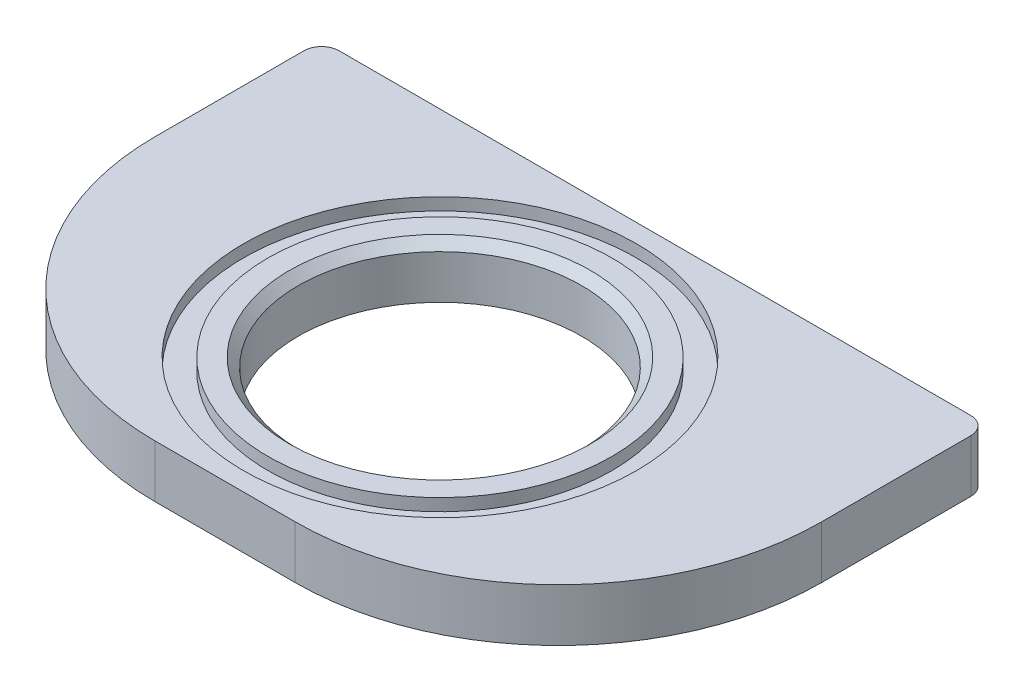
ISO-10303-21;
HEADER;
FILE_DESCRIPTION(('STEP AP214'),'2;1');
FILE_NAME('part.step','',(''),(''),'','','');
FILE_SCHEMA(('AUTOMOTIVE_DESIGN { 1 0 10303 214 1 1 1 1 }'));
ENDSEC;
DATA;
#1=APPLICATION_CONTEXT('core data for automotive mechanical design processes');
#2=APPLICATION_PROTOCOL_DEFINITION('international standard','automotive_design',2000,#1);
#3=PRODUCT_CONTEXT('',#1,'mechanical');
#4=PRODUCT('Part','Part','',(#3));
#5=PRODUCT_RELATED_PRODUCT_CATEGORY('part','',(#4));
#6=PRODUCT_DEFINITION_FORMATION('','',#4);
#7=PRODUCT_DEFINITION_CONTEXT('part definition',#1,'design');
#8=PRODUCT_DEFINITION('design','',#6,#7);
#9=PRODUCT_DEFINITION_SHAPE('','',#8);
#10=(LENGTH_UNIT() NAMED_UNIT(*) SI_UNIT(.MILLI.,.METRE.));
#11=(NAMED_UNIT(*) PLANE_ANGLE_UNIT() SI_UNIT($,.RADIAN.));
#12=(NAMED_UNIT(*) SI_UNIT($,.STERADIAN.) SOLID_ANGLE_UNIT());
#13=UNCERTAINTY_MEASURE_WITH_UNIT(LENGTH_MEASURE(1.E-05),#10,'distance_accuracy_value','');
#14=(GEOMETRIC_REPRESENTATION_CONTEXT(3) GLOBAL_UNCERTAINTY_ASSIGNED_CONTEXT((#13)) GLOBAL_UNIT_ASSIGNED_CONTEXT((#10,
#11,#12)) REPRESENTATION_CONTEXT('',''));
#15=CARTESIAN_POINT('',(0.,0.,0.));
#16=DIRECTION('',(0.,0.,1.));
#17=DIRECTION('',(1.,0.,0.));
#18=AXIS2_PLACEMENT_3D('',#15,#16,#17);
#19=CARTESIAN_POINT('',(0.,3.,0.));
#20=DIRECTION('',(0.,1.,0.));
#21=DIRECTION('',(0.,0.,1.));
#22=AXIS2_PLACEMENT_3D('',#19,#20,#21);
#23=PLANE('',#22);
#24=CARTESIAN_POINT('',(0.,3.,0.));
#25=DIRECTION('',(0.,1.,0.));
#26=DIRECTION('',(0.,0.,1.));
#27=AXIS2_PLACEMENT_3D('',#24,#25,#26);
#28=CIRCLE('',#27,8.57500000000001);
#29=CARTESIAN_POINT('',(0.,3.,8.57500000000001));
#30=VERTEX_POINT('',#29);
#31=EDGE_CURVE('E11',#30,#30,#28,.F.);
#32=ORIENTED_EDGE('',*,*,#31,.T.);
#33=EDGE_LOOP('',(#32));
#34=FACE_BOUND('',#33,.T.);
#35=CARTESIAN_POINT('',(0.,3.,0.));
#36=DIRECTION('',(0.,1.,0.));
#37=DIRECTION('',(0.,0.,1.));
#38=AXIS2_PLACEMENT_3D('',#35,#36,#37);
#39=CIRCLE('',#38,9.8);
#40=CARTESIAN_POINT('',(9.8,3.,0.));
#41=VERTEX_POINT('',#40);
#42=EDGE_CURVE('E126',#41,#41,#39,.T.);
#43=ORIENTED_EDGE('',*,*,#42,.T.);
#44=EDGE_LOOP('',(#43));
#45=FACE_BOUND('',#44,.T.);
#46=ADVANCED_FACE('F39',(#34,#45),#23,.T.);
#47=CARTESIAN_POINT('',(0.,3.,0.));
#48=DIRECTION('',(0.,1.,0.));
#49=DIRECTION('',(0.,0.,1.));
#50=AXIS2_PLACEMENT_3D('',#47,#48,#49);
#51=CIRCLE('',#50,11.2);
#52=CARTESIAN_POINT('',(11.2,3.,0.));
#53=VERTEX_POINT('',#52);
#54=EDGE_CURVE('E178',#53,#53,#51,.F.);
#55=ORIENTED_EDGE('',*,*,#54,.T.);
#56=EDGE_LOOP('',(#55));
#57=FACE_BOUND('',#56,.T.);
#58=DIRECTION('',(-1.,0.,0.));
#59=VECTOR('',#58,1.);
#60=CARTESIAN_POINT('',(-19.,3.,-12.25));
#61=LINE('',#60,#59);
#62=CARTESIAN_POINT('',(18.,3.,-12.25));
#63=VERTEX_POINT('',#62);
#64=CARTESIAN_POINT('',(-18.,3.,-12.25));
#65=VERTEX_POINT('',#64);
#66=EDGE_CURVE('E149',#63,#65,#61,.T.);
#67=ORIENTED_EDGE('',*,*,#66,.T.);
#68=CARTESIAN_POINT('',(-18.,3.,-11.25));
#69=DIRECTION('',(0.,1.,0.));
#70=DIRECTION('',(0.,0.,1.));
#71=AXIS2_PLACEMENT_3D('',#68,#69,#70);
#72=CIRCLE('',#71,1.);
#73=CARTESIAN_POINT('',(-19.,3.,-11.25));
#74=VERTEX_POINT('',#73);
#75=EDGE_CURVE('E195',#65,#74,#72,.T.);
#76=ORIENTED_EDGE('',*,*,#75,.T.);
#77=DIRECTION('',(0.,0.,1.));
#78=VECTOR('',#77,1.);
#79=CARTESIAN_POINT('',(-19.,3.,-12.25));
#80=LINE('',#79,#78);
#81=CARTESIAN_POINT('',(-19.,3.,-2.75));
#82=VERTEX_POINT('',#81);
#83=EDGE_CURVE('E141',#74,#82,#80,.T.);
#84=ORIENTED_EDGE('',*,*,#83,.T.);
#85=CARTESIAN_POINT('',(-4.,3.,-2.75));
#86=DIRECTION('',(0.,1.,0.));
#87=DIRECTION('',(0.,0.,1.));
#88=AXIS2_PLACEMENT_3D('',#85,#86,#87);
#89=CIRCLE('',#88,15.);
#90=CARTESIAN_POINT('',(-4.,3.,12.25));
#91=VERTEX_POINT('',#90);
#92=EDGE_CURVE('E171',#82,#91,#89,.T.);
#93=ORIENTED_EDGE('',*,*,#92,.T.);
#94=DIRECTION('',(1.,0.,0.));
#95=VECTOR('',#94,1.);
#96=CARTESIAN_POINT('',(-19.,3.,12.25));
#97=LINE('',#96,#95);
#98=CARTESIAN_POINT('',(4.,3.,12.25));
#99=VERTEX_POINT('',#98);
#100=EDGE_CURVE('E143',#91,#99,#97,.T.);
#101=ORIENTED_EDGE('',*,*,#100,.T.);
#102=CARTESIAN_POINT('',(4.,3.,-2.75));
#103=DIRECTION('',(0.,1.,0.));
#104=DIRECTION('',(0.,0.,1.));
#105=AXIS2_PLACEMENT_3D('',#102,#103,#104);
#106=CIRCLE('',#105,15.);
#107=CARTESIAN_POINT('',(19.,3.,-2.75));
#108=VERTEX_POINT('',#107);
#109=EDGE_CURVE('E173',#99,#108,#106,.T.);
#110=ORIENTED_EDGE('',*,*,#109,.T.);
#111=DIRECTION('',(0.,0.,-1.));
#112=VECTOR('',#111,1.);
#113=CARTESIAN_POINT('',(19.,3.,-12.25));
#114=LINE('',#113,#112);
#115=CARTESIAN_POINT('',(19.,3.,-11.25));
#116=VERTEX_POINT('',#115);
#117=EDGE_CURVE('E147',#108,#116,#114,.T.);
#118=ORIENTED_EDGE('',*,*,#117,.T.);
#119=CARTESIAN_POINT('',(18.,3.,-11.25));
#120=DIRECTION('',(0.,1.,0.));
#121=DIRECTION('',(0.,0.,1.));
#122=AXIS2_PLACEMENT_3D('',#119,#120,#121);
#123=CIRCLE('',#122,1.);
#124=EDGE_CURVE('E193',#116,#63,#123,.T.);
#125=ORIENTED_EDGE('',*,*,#124,.T.);
#126=EDGE_LOOP('',(#67,#76,#84,#93,#101,#110,#118,#125));
#127=FACE_BOUND('',#126,.T.);
#128=ADVANCED_FACE('F213',(#57,#127),#23,.T.);
#129=CARTESIAN_POINT('',(0.,0.,0.));
#130=DIRECTION('',(0.,1.,0.));
#131=DIRECTION('',(0.,0.,1.));
#132=AXIS2_PLACEMENT_3D('',#129,#130,#131);
#133=PLANE('',#132);
#134=DIRECTION('',(0.,0.,1.));
#135=VECTOR('',#134,1.);
#136=CARTESIAN_POINT('',(-19.,0.,-12.25));
#137=LINE('',#136,#135);
#138=CARTESIAN_POINT('',(-19.,0.,-11.25));
#139=VERTEX_POINT('',#138);
#140=CARTESIAN_POINT('',(-19.,0.,-2.75));
#141=VERTEX_POINT('',#140);
#142=EDGE_CURVE('E140',#139,#141,#137,.T.);
#143=ORIENTED_EDGE('',*,*,#142,.F.);
#144=CARTESIAN_POINT('',(-18.,0.,-11.25));
#145=DIRECTION('',(0.,1.,0.));
#146=DIRECTION('',(0.,0.,1.));
#147=AXIS2_PLACEMENT_3D('',#144,#145,#146);
#148=CIRCLE('',#147,1.);
#149=CARTESIAN_POINT('',(-18.,0.,-12.25));
#150=VERTEX_POINT('',#149);
#151=EDGE_CURVE('E187',#139,#150,#148,.F.);
#152=ORIENTED_EDGE('',*,*,#151,.T.);
#153=DIRECTION('',(-1.,0.,0.));
#154=VECTOR('',#153,1.);
#155=CARTESIAN_POINT('',(-19.,0.,-12.25));
#156=LINE('',#155,#154);
#157=CARTESIAN_POINT('',(18.,0.,-12.25));
#158=VERTEX_POINT('',#157);
#159=EDGE_CURVE('E144',#158,#150,#156,.T.);
#160=ORIENTED_EDGE('',*,*,#159,.F.);
#161=CARTESIAN_POINT('',(18.,0.,-11.25));
#162=DIRECTION('',(0.,1.,0.));
#163=DIRECTION('',(0.,0.,1.));
#164=AXIS2_PLACEMENT_3D('',#161,#162,#163);
#165=CIRCLE('',#164,1.);
#166=CARTESIAN_POINT('',(19.,0.,-11.25));
#167=VERTEX_POINT('',#166);
#168=EDGE_CURVE('E185',#158,#167,#165,.F.);
#169=ORIENTED_EDGE('',*,*,#168,.T.);
#170=DIRECTION('',(0.,0.,-1.));
#171=VECTOR('',#170,1.);
#172=CARTESIAN_POINT('',(19.,0.,-12.25));
#173=LINE('',#172,#171);
#174=CARTESIAN_POINT('',(19.,0.,-2.75));
#175=VERTEX_POINT('',#174);
#176=EDGE_CURVE('E156',#175,#167,#173,.T.);
#177=ORIENTED_EDGE('',*,*,#176,.F.);
#178=CARTESIAN_POINT('',(4.,0.,-2.75));
#179=DIRECTION('',(0.,1.,0.));
#180=DIRECTION('',(0.,0.,1.));
#181=AXIS2_PLACEMENT_3D('',#178,#179,#180);
#182=CIRCLE('',#181,15.);
#183=CARTESIAN_POINT('',(4.,0.,12.25));
#184=VERTEX_POINT('',#183);
#185=EDGE_CURVE('E164',#175,#184,#182,.F.);
#186=ORIENTED_EDGE('',*,*,#185,.T.);
#187=DIRECTION('',(1.,0.,0.));
#188=VECTOR('',#187,1.);
#189=CARTESIAN_POINT('',(-19.,0.,12.25));
#190=LINE('',#189,#188);
#191=CARTESIAN_POINT('',(-4.,0.,12.25));
#192=VERTEX_POINT('',#191);
#193=EDGE_CURVE('E153',#192,#184,#190,.T.);
#194=ORIENTED_EDGE('',*,*,#193,.F.);
#195=CARTESIAN_POINT('',(-4.,0.,-2.75));
#196=DIRECTION('',(0.,1.,0.));
#197=DIRECTION('',(0.,0.,1.));
#198=AXIS2_PLACEMENT_3D('',#195,#196,#197);
#199=CIRCLE('',#198,15.);
#200=EDGE_CURVE('E161',#192,#141,#199,.F.);
#201=ORIENTED_EDGE('',*,*,#200,.T.);
#202=EDGE_LOOP('',(#143,#152,#160,#169,#177,#186,#194,#201));
#203=FACE_BOUND('',#202,.T.);
#204=CARTESIAN_POINT('',(0.,0.,0.));
#205=DIRECTION('',(0.,1.,0.));
#206=DIRECTION('',(0.,0.,1.));
#207=AXIS2_PLACEMENT_3D('',#204,#205,#206);
#208=CIRCLE('',#207,8.075);
#209=CARTESIAN_POINT('',(0.,0.,8.075));
#210=VERTEX_POINT('',#209);
#211=EDGE_CURVE('E136',#210,#210,#208,.T.);
#212=ORIENTED_EDGE('',*,*,#211,.T.);
#213=EDGE_LOOP('',(#212));
#214=FACE_BOUND('',#213,.T.);
#215=ADVANCED_FACE('F221',(#203,#214),#133,.F.);
#216=CARTESIAN_POINT('',(-19.,3.,-12.25));
#217=DIRECTION('',(1.,0.,0.));
#218=DIRECTION('',(0.,0.,-1.));
#219=AXIS2_PLACEMENT_3D('',#216,#217,#218);
#220=PLANE('',#219);
#221=ORIENTED_EDGE('',*,*,#83,.F.);
#222=DIRECTION('',(0.,-1.,0.));
#223=VECTOR('',#222,1.);
#224=CARTESIAN_POINT('',(-19.,3.,-11.25));
#225=LINE('',#224,#223);
#226=EDGE_CURVE('E182',#74,#139,#225,.T.);
#227=ORIENTED_EDGE('',*,*,#226,.T.);
#228=ORIENTED_EDGE('',*,*,#142,.T.);
#229=DIRECTION('',(0.,-1.,0.));
#230=VECTOR('',#229,1.);
#231=CARTESIAN_POINT('',(-19.,3.,-2.75));
#232=LINE('',#231,#230);
#233=EDGE_CURVE('E175',#141,#82,#232,.F.);
#234=ORIENTED_EDGE('',*,*,#233,.T.);
#235=EDGE_LOOP('',(#221,#227,#228,#234));
#236=FACE_BOUND('',#235,.T.);
#237=ADVANCED_FACE('F229',(#236),#220,.F.);
#238=CARTESIAN_POINT('',(-19.,3.,12.25));
#239=DIRECTION('',(0.,0.,-1.));
#240=DIRECTION('',(-1.,0.,0.));
#241=AXIS2_PLACEMENT_3D('',#238,#239,#240);
#242=PLANE('',#241);
#243=ORIENTED_EDGE('',*,*,#193,.T.);
#244=DIRECTION('',(0.,-1.,0.));
#245=VECTOR('',#244,1.);
#246=CARTESIAN_POINT('',(4.,3.,12.25));
#247=LINE('',#246,#245);
#248=EDGE_CURVE('E169',#184,#99,#247,.F.);
#249=ORIENTED_EDGE('',*,*,#248,.T.);
#250=ORIENTED_EDGE('',*,*,#100,.F.);
#251=DIRECTION('',(0.,-1.,0.));
#252=VECTOR('',#251,1.);
#253=CARTESIAN_POINT('',(-4.,3.,12.25));
#254=LINE('',#253,#252);
#255=EDGE_CURVE('E166',#91,#192,#254,.T.);
#256=ORIENTED_EDGE('',*,*,#255,.T.);
#257=EDGE_LOOP('',(#243,#249,#250,#256));
#258=FACE_BOUND('',#257,.T.);
#259=ADVANCED_FACE('F237',(#258),#242,.F.);
#260=CARTESIAN_POINT('',(19.,3.,-12.25));
#261=DIRECTION('',(-1.,0.,0.));
#262=DIRECTION('',(0.,0.,1.));
#263=AXIS2_PLACEMENT_3D('',#260,#261,#262);
#264=PLANE('',#263);
#265=ORIENTED_EDGE('',*,*,#176,.T.);
#266=DIRECTION('',(0.,-1.,0.));
#267=VECTOR('',#266,1.);
#268=CARTESIAN_POINT('',(19.,3.,-11.25));
#269=LINE('',#268,#267);
#270=EDGE_CURVE('E55',#167,#116,#269,.F.);
#271=ORIENTED_EDGE('',*,*,#270,.T.);
#272=ORIENTED_EDGE('',*,*,#117,.F.);
#273=DIRECTION('',(0.,-1.,0.));
#274=VECTOR('',#273,1.);
#275=CARTESIAN_POINT('',(19.,3.,-2.75));
#276=LINE('',#275,#274);
#277=EDGE_CURVE('E151',#108,#175,#276,.T.);
#278=ORIENTED_EDGE('',*,*,#277,.T.);
#279=EDGE_LOOP('',(#265,#271,#272,#278));
#280=FACE_BOUND('',#279,.T.);
#281=ADVANCED_FACE('F234',(#280),#264,.F.);
#282=CARTESIAN_POINT('',(-19.,3.,-12.25));
#283=DIRECTION('',(0.,0.,1.));
#284=DIRECTION('',(1.,0.,0.));
#285=AXIS2_PLACEMENT_3D('',#282,#283,#284);
#286=PLANE('',#285);
#287=ORIENTED_EDGE('',*,*,#159,.T.);
#288=DIRECTION('',(0.,-1.,0.));
#289=VECTOR('',#288,1.);
#290=CARTESIAN_POINT('',(-18.,3.,-12.25));
#291=LINE('',#290,#289);
#292=EDGE_CURVE('E63',#150,#65,#291,.F.);
#293=ORIENTED_EDGE('',*,*,#292,.T.);
#294=ORIENTED_EDGE('',*,*,#66,.F.);
#295=DIRECTION('',(0.,-1.,0.));
#296=VECTOR('',#295,1.);
#297=CARTESIAN_POINT('',(18.,3.,-12.25));
#298=LINE('',#297,#296);
#299=EDGE_CURVE('E189',#63,#158,#298,.T.);
#300=ORIENTED_EDGE('',*,*,#299,.T.);
#301=EDGE_LOOP('',(#287,#293,#294,#300));
#302=FACE_BOUND('',#301,.T.);
#303=ADVANCED_FACE('F231',(#302),#286,.F.);
#304=CARTESIAN_POINT('',(0.,3.,0.));
#305=DIRECTION('',(0.,-1.,0.));
#306=DIRECTION('',(0.,0.,-1.));
#307=AXIS2_PLACEMENT_3D('',#304,#305,#306);
#308=CYLINDRICAL_SURFACE('',#307,8.075);
#309=CARTESIAN_POINT('',(0.,2.49999999999999,0.));
#310=DIRECTION('',(0.,1.,0.));
#311=DIRECTION('',(0.,0.,1.));
#312=AXIS2_PLACEMENT_3D('',#309,#310,#311);
#313=CIRCLE('',#312,8.075);
#314=CARTESIAN_POINT('',(0.,2.49999999999999,8.075));
#315=VERTEX_POINT('',#314);
#316=EDGE_CURVE('E48',#315,#315,#313,.T.);
#317=ORIENTED_EDGE('',*,*,#316,.T.);
#318=EDGE_LOOP('',(#317));
#319=FACE_BOUND('',#318,.T.);
#320=ORIENTED_EDGE('',*,*,#211,.F.);
#321=EDGE_LOOP('',(#320));
#322=FACE_BOUND('',#321,.T.);
#323=ADVANCED_FACE('F200',(#319,#322),#308,.F.);
#324=CARTESIAN_POINT('',(4.,3.,-2.75));
#325=DIRECTION('',(0.,-1.,0.));
#326=DIRECTION('',(0.,0.,-1.));
#327=AXIS2_PLACEMENT_3D('',#324,#325,#326);
#328=CYLINDRICAL_SURFACE('',#327,15.);
#329=ORIENTED_EDGE('',*,*,#109,.F.);
#330=ORIENTED_EDGE('',*,*,#248,.F.);
#331=ORIENTED_EDGE('',*,*,#185,.F.);
#332=ORIENTED_EDGE('',*,*,#277,.F.);
#333=EDGE_LOOP('',(#329,#330,#331,#332));
#334=FACE_BOUND('',#333,.T.);
#335=ADVANCED_FACE('F244',(#334),#328,.T.);
#336=CARTESIAN_POINT('',(-4.,3.,-2.75));
#337=DIRECTION('',(0.,-1.,0.));
#338=DIRECTION('',(0.,0.,-1.));
#339=AXIS2_PLACEMENT_3D('',#336,#337,#338);
#340=CYLINDRICAL_SURFACE('',#339,15.);
#341=ORIENTED_EDGE('',*,*,#92,.F.);
#342=ORIENTED_EDGE('',*,*,#233,.F.);
#343=ORIENTED_EDGE('',*,*,#200,.F.);
#344=ORIENTED_EDGE('',*,*,#255,.F.);
#345=EDGE_LOOP('',(#341,#342,#343,#344));
#346=FACE_BOUND('',#345,.T.);
#347=ADVANCED_FACE('F247',(#346),#340,.T.);
#348=CARTESIAN_POINT('',(0.,3.,0.));
#349=DIRECTION('',(0.,1.,0.));
#350=DIRECTION('',(0.,0.,1.));
#351=AXIS2_PLACEMENT_3D('',#348,#349,#350);
#352=CYLINDRICAL_SURFACE('',#351,9.8);
#353=DIRECTION('',(0.,-1.,0.));
#354=VECTOR('',#353,1.);
#355=CARTESIAN_POINT('',(9.8,3.7,0.));
#356=LINE('',#355,#354);
#357=CARTESIAN_POINT('',(9.8,2.3,0.));
#358=VERTEX_POINT('',#357);
#359=EDGE_CURVE('E121',#41,#358,#356,.T.);
#360=ORIENTED_EDGE('',*,*,#359,.T.);
#361=CARTESIAN_POINT('',(0.,2.3,0.));
#362=DIRECTION('',(0.,1.,0.));
#363=DIRECTION('',(1.,0.,0.));
#364=AXIS2_PLACEMENT_3D('',#361,#362,#363);
#365=CIRCLE('',#364,9.8);
#366=EDGE_CURVE('E124',#358,#358,#365,.T.);
#367=ORIENTED_EDGE('',*,*,#366,.T.);
#368=ORIENTED_EDGE('',*,*,#359,.F.);
#369=ORIENTED_EDGE('',*,*,#42,.F.);
#370=EDGE_LOOP('',(#360,#367,#368,#369));
#371=FACE_BOUND('',#370,.T.);
#372=ADVANCED_FACE('F122',(#371),#352,.T.);
#373=CARTESIAN_POINT('',(9.8,2.3,0.));
#374=DIRECTION('',(0.,1.,0.));
#375=DIRECTION('',(0.,0.,1.));
#376=AXIS2_PLACEMENT_3D('',#373,#374,#375);
#377=PLANE('',#376);
#378=CARTESIAN_POINT('',(0.,2.3,0.));
#379=DIRECTION('',(0.,1.,0.));
#380=DIRECTION('',(1.,0.,0.));
#381=AXIS2_PLACEMENT_3D('',#378,#379,#380);
#382=CIRCLE('',#381,11.2);
#383=CARTESIAN_POINT('',(11.2,2.3,0.));
#384=VERTEX_POINT('',#383);
#385=EDGE_CURVE('E132',#384,#384,#382,.T.);
#386=ORIENTED_EDGE('',*,*,#385,.T.);
#387=EDGE_LOOP('',(#386));
#388=FACE_BOUND('',#387,.T.);
#389=ORIENTED_EDGE('',*,*,#366,.F.);
#390=EDGE_LOOP('',(#389));
#391=FACE_BOUND('',#390,.T.);
#392=ADVANCED_FACE('F258',(#388,#391),#377,.T.);
#393=CARTESIAN_POINT('',(0.,3.,0.));
#394=DIRECTION('',(0.,1.,0.));
#395=DIRECTION('',(0.,0.,1.));
#396=AXIS2_PLACEMENT_3D('',#393,#394,#395);
#397=CYLINDRICAL_SURFACE('',#396,11.2);
#398=DIRECTION('',(0.,1.,0.));
#399=VECTOR('',#398,1.);
#400=CARTESIAN_POINT('',(11.2,3.7,0.));
#401=LINE('',#400,#399);
#402=EDGE_CURVE('E129',#384,#53,#401,.T.);
#403=ORIENTED_EDGE('',*,*,#402,.F.);
#404=ORIENTED_EDGE('',*,*,#385,.F.);
#405=ORIENTED_EDGE('',*,*,#402,.T.);
#406=ORIENTED_EDGE('',*,*,#54,.F.);
#407=EDGE_LOOP('',(#403,#404,#405,#406));
#408=FACE_BOUND('',#407,.T.);
#409=ADVANCED_FACE('F253',(#408),#397,.F.);
#410=CARTESIAN_POINT('',(-18.,3.,-11.25));
#411=DIRECTION('',(0.,-1.,0.));
#412=DIRECTION('',(0.,0.,-1.));
#413=AXIS2_PLACEMENT_3D('',#410,#411,#412);
#414=CYLINDRICAL_SURFACE('',#413,1.);
#415=ORIENTED_EDGE('',*,*,#75,.F.);
#416=ORIENTED_EDGE('',*,*,#292,.F.);
#417=ORIENTED_EDGE('',*,*,#151,.F.);
#418=ORIENTED_EDGE('',*,*,#226,.F.);
#419=EDGE_LOOP('',(#415,#416,#417,#418));
#420=FACE_BOUND('',#419,.T.);
#421=ADVANCED_FACE('F209',(#420),#414,.T.);
#422=CARTESIAN_POINT('',(18.,3.,-11.25));
#423=DIRECTION('',(0.,-1.,0.));
#424=DIRECTION('',(0.,0.,-1.));
#425=AXIS2_PLACEMENT_3D('',#422,#423,#424);
#426=CYLINDRICAL_SURFACE('',#425,1.);
#427=ORIENTED_EDGE('',*,*,#124,.F.);
#428=ORIENTED_EDGE('',*,*,#270,.F.);
#429=ORIENTED_EDGE('',*,*,#168,.F.);
#430=ORIENTED_EDGE('',*,*,#299,.F.);
#431=EDGE_LOOP('',(#427,#428,#429,#430));
#432=FACE_BOUND('',#431,.T.);
#433=ADVANCED_FACE('F204',(#432),#426,.T.);
#434=CARTESIAN_POINT('',(0.,2.49999999999999,0.));
#435=DIRECTION('',(0.,1.,0.));
#436=DIRECTION('',(0.,0.,1.));
#437=AXIS2_PLACEMENT_3D('',#434,#435,#436);
#438=CONICAL_SURFACE('',#437,8.075,0.785398163397455);
#439=ORIENTED_EDGE('',*,*,#31,.F.);
#440=EDGE_LOOP('',(#439));
#441=FACE_BOUND('',#440,.T.);
#442=ORIENTED_EDGE('',*,*,#316,.F.);
#443=EDGE_LOOP('',(#442));
#444=FACE_BOUND('',#443,.T.);
#445=ADVANCED_FACE('F42',(#441,#444),#438,.F.);
#446=CLOSED_SHELL('',(#46,#128,#215,#237,#259,#281,#303,#323,#335,#347,#372,#392,#409,#421,#433,#445));
#447=MANIFOLD_SOLID_BREP('B2',#446);
#448=ADVANCED_BREP_SHAPE_REPRESENTATION('',(#18,#447),#14);
#449=SHAPE_DEFINITION_REPRESENTATION(#9,#448);
ENDSEC;
END-ISO-10303-21;
